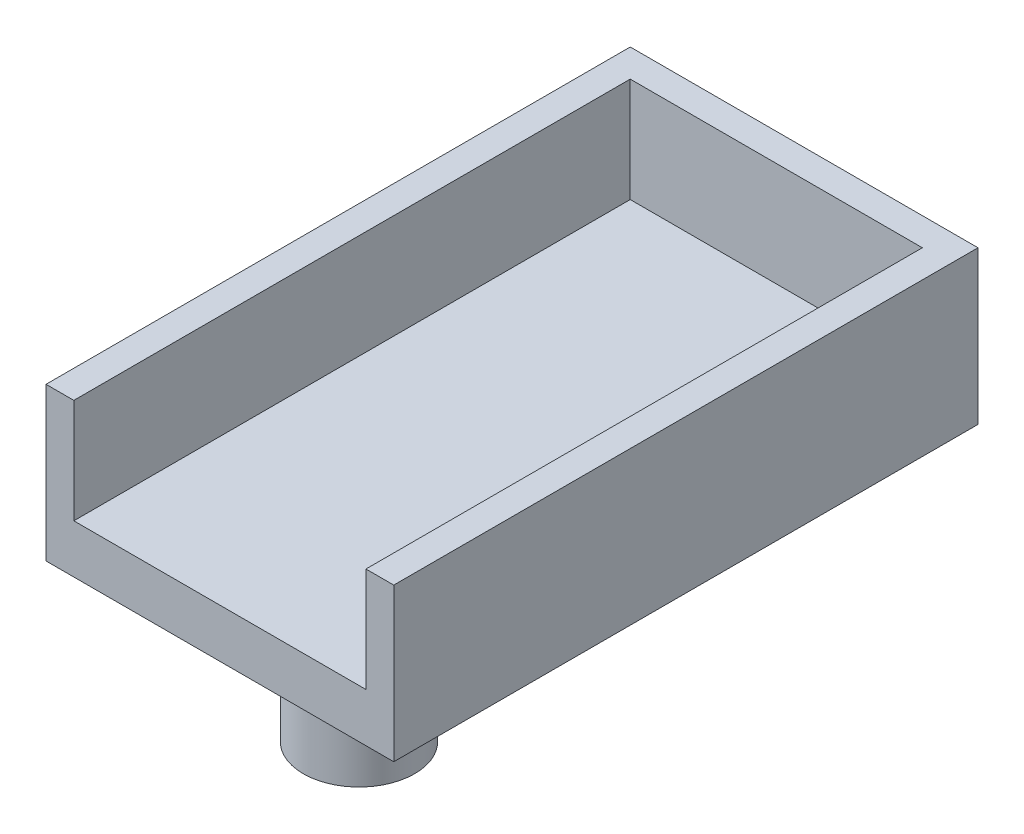
ISO-10303-21;
HEADER;
FILE_DESCRIPTION(('STEP AP214'),'2;1');
FILE_NAME('part.step','',(''),(''),'','','');
FILE_SCHEMA(('AUTOMOTIVE_DESIGN { 1 0 10303 214 1 1 1 1 }'));
ENDSEC;
DATA;
#1=APPLICATION_CONTEXT('core data for automotive mechanical design processes');
#2=APPLICATION_PROTOCOL_DEFINITION('international standard','automotive_design',2000,#1);
#3=PRODUCT_CONTEXT('',#1,'mechanical');
#4=PRODUCT('Part','Part','',(#3));
#5=PRODUCT_RELATED_PRODUCT_CATEGORY('part','',(#4));
#6=PRODUCT_DEFINITION_FORMATION('','',#4);
#7=PRODUCT_DEFINITION_CONTEXT('part definition',#1,'design');
#8=PRODUCT_DEFINITION('design','',#6,#7);
#9=PRODUCT_DEFINITION_SHAPE('','',#8);
#10=(LENGTH_UNIT() NAMED_UNIT(*) SI_UNIT(.MILLI.,.METRE.));
#11=(NAMED_UNIT(*) PLANE_ANGLE_UNIT() SI_UNIT($,.RADIAN.));
#12=(NAMED_UNIT(*) SI_UNIT($,.STERADIAN.) SOLID_ANGLE_UNIT());
#13=UNCERTAINTY_MEASURE_WITH_UNIT(LENGTH_MEASURE(1.E-05),#10,'distance_accuracy_value','');
#14=(GEOMETRIC_REPRESENTATION_CONTEXT(3) GLOBAL_UNCERTAINTY_ASSIGNED_CONTEXT((#13)) GLOBAL_UNIT_ASSIGNED_CONTEXT((#10,
#11,#12)) REPRESENTATION_CONTEXT('',''));
#15=CARTESIAN_POINT('',(0.,0.,0.));
#16=DIRECTION('',(0.,0.,1.));
#17=DIRECTION('',(1.,0.,0.));
#18=AXIS2_PLACEMENT_3D('',#15,#16,#17);
#19=CARTESIAN_POINT('',(0.,3.5,0.));
#20=DIRECTION('',(0.,1.,0.));
#21=DIRECTION('',(0.,0.,1.));
#22=AXIS2_PLACEMENT_3D('',#19,#20,#21);
#23=PLANE('',#22);
#24=DIRECTION('',(1.,0.,0.));
#25=VECTOR('',#24,1.);
#26=CARTESIAN_POINT('',(0.,3.5,0.));
#27=LINE('',#26,#25);
#28=CARTESIAN_POINT('',(2.,3.5,0.));
#29=VERTEX_POINT('',#28);
#30=CARTESIAN_POINT('',(23.,3.5,0.));
#31=VERTEX_POINT('',#30);
#32=EDGE_CURVE('E55',#29,#31,#27,.T.);
#33=ORIENTED_EDGE('',*,*,#32,.T.);
#34=DIRECTION('',(0.,0.,1.));
#35=VECTOR('',#34,1.);
#36=CARTESIAN_POINT('',(23.,3.5,-40.));
#37=LINE('',#36,#35);
#38=CARTESIAN_POINT('',(23.,3.5,-40.));
#39=VERTEX_POINT('',#38);
#40=EDGE_CURVE('E132',#39,#31,#37,.T.);
#41=ORIENTED_EDGE('',*,*,#40,.F.);
#42=DIRECTION('',(-1.,0.,0.));
#43=VECTOR('',#42,1.);
#44=CARTESIAN_POINT('',(0.,3.5,-40.));
#45=LINE('',#44,#43);
#46=CARTESIAN_POINT('',(2.,3.5,-40.));
#47=VERTEX_POINT('',#46);
#48=EDGE_CURVE('E48',#39,#47,#45,.T.);
#49=ORIENTED_EDGE('',*,*,#48,.T.);
#50=DIRECTION('',(0.,0.,-1.));
#51=VECTOR('',#50,1.);
#52=CARTESIAN_POINT('',(2.,3.5,0.));
#53=LINE('',#52,#51);
#54=EDGE_CURVE('E147',#29,#47,#53,.T.);
#55=ORIENTED_EDGE('',*,*,#54,.F.);
#56=EDGE_LOOP('',(#33,#41,#49,#55));
#57=FACE_BOUND('',#56,.T.);
#58=ADVANCED_FACE('F33',(#57),#23,.T.);
#59=CARTESIAN_POINT('',(0.,3.5,-40.));
#60=DIRECTION('',(1.,0.,0.));
#61=DIRECTION('',(0.,0.,-1.));
#62=AXIS2_PLACEMENT_3D('',#59,#60,#61);
#63=PLANE('',#62);
#64=DIRECTION('',(0.,0.,1.));
#65=VECTOR('',#64,1.);
#66=CARTESIAN_POINT('',(0.,0.,-40.));
#67=LINE('',#66,#65);
#68=CARTESIAN_POINT('',(0.,0.,-42.));
#69=VERTEX_POINT('',#68);
#70=CARTESIAN_POINT('',(0.,0.,0.));
#71=VERTEX_POINT('',#70);
#72=EDGE_CURVE('E114',#69,#71,#67,.T.);
#73=ORIENTED_EDGE('',*,*,#72,.T.);
#74=DIRECTION('',(0.,-1.,0.));
#75=VECTOR('',#74,1.);
#76=CARTESIAN_POINT('',(0.,3.5,0.));
#77=LINE('',#76,#75);
#78=CARTESIAN_POINT('',(0.,11.,0.));
#79=VERTEX_POINT('',#78);
#80=EDGE_CURVE('E41',#79,#71,#77,.T.);
#81=ORIENTED_EDGE('',*,*,#80,.F.);
#82=DIRECTION('',(0.,0.,1.));
#83=VECTOR('',#82,1.);
#84=CARTESIAN_POINT('',(0.,11.,0.));
#85=LINE('',#84,#83);
#86=CARTESIAN_POINT('',(0.,11.,-42.));
#87=VERTEX_POINT('',#86);
#88=EDGE_CURVE('E148',#87,#79,#85,.T.);
#89=ORIENTED_EDGE('',*,*,#88,.F.);
#90=DIRECTION('',(0.,-1.,0.));
#91=VECTOR('',#90,1.);
#92=CARTESIAN_POINT('',(0.,11.,-42.));
#93=LINE('',#92,#91);
#94=EDGE_CURVE('E118',#87,#69,#93,.T.);
#95=ORIENTED_EDGE('',*,*,#94,.T.);
#96=EDGE_LOOP('',(#73,#81,#89,#95));
#97=FACE_BOUND('',#96,.T.);
#98=ADVANCED_FACE('F35',(#97),#63,.F.);
#99=CARTESIAN_POINT('',(0.,3.5,0.));
#100=DIRECTION('',(0.,0.,-1.));
#101=DIRECTION('',(-1.,0.,0.));
#102=AXIS2_PLACEMENT_3D('',#99,#100,#101);
#103=PLANE('',#102);
#104=DIRECTION('',(1.,0.,0.));
#105=VECTOR('',#104,1.);
#106=CARTESIAN_POINT('',(0.,0.,0.));
#107=LINE('',#106,#105);
#108=CARTESIAN_POINT('',(25.,0.,0.));
#109=VERTEX_POINT('',#108);
#110=EDGE_CURVE('E108',#71,#109,#107,.T.);
#111=ORIENTED_EDGE('',*,*,#110,.T.);
#112=DIRECTION('',(0.,-1.,0.));
#113=VECTOR('',#112,1.);
#114=CARTESIAN_POINT('',(25.,3.5,0.));
#115=LINE('',#114,#113);
#116=CARTESIAN_POINT('',(25.,11.,0.));
#117=VERTEX_POINT('',#116);
#118=EDGE_CURVE('E106',#117,#109,#115,.T.);
#119=ORIENTED_EDGE('',*,*,#118,.F.);
#120=DIRECTION('',(1.,0.,0.));
#121=VECTOR('',#120,1.);
#122=CARTESIAN_POINT('',(25.,11.,0.));
#123=LINE('',#122,#121);
#124=CARTESIAN_POINT('',(23.,11.,0.));
#125=VERTEX_POINT('',#124);
#126=EDGE_CURVE('E137',#125,#117,#123,.T.);
#127=ORIENTED_EDGE('',*,*,#126,.F.);
#128=DIRECTION('',(0.,-1.,0.));
#129=VECTOR('',#128,1.);
#130=CARTESIAN_POINT('',(23.,11.,0.));
#131=LINE('',#130,#129);
#132=EDGE_CURVE('E140',#125,#31,#131,.T.);
#133=ORIENTED_EDGE('',*,*,#132,.T.);
#134=ORIENTED_EDGE('',*,*,#32,.F.);
#135=DIRECTION('',(0.,-1.,0.));
#136=VECTOR('',#135,1.);
#137=CARTESIAN_POINT('',(2.,11.,0.));
#138=LINE('',#137,#136);
#139=CARTESIAN_POINT('',(2.,11.,0.));
#140=VERTEX_POINT('',#139);
#141=EDGE_CURVE('E160',#140,#29,#138,.T.);
#142=ORIENTED_EDGE('',*,*,#141,.F.);
#143=DIRECTION('',(1.,0.,0.));
#144=VECTOR('',#143,1.);
#145=CARTESIAN_POINT('',(0.,11.,0.));
#146=LINE('',#145,#144);
#147=EDGE_CURVE('E151',#79,#140,#146,.T.);
#148=ORIENTED_EDGE('',*,*,#147,.F.);
#149=ORIENTED_EDGE('',*,*,#80,.T.);
#150=EDGE_LOOP('',(#111,#119,#127,#133,#134,#142,#148,#149));
#151=FACE_BOUND('',#150,.T.);
#152=ADVANCED_FACE('F170',(#151),#103,.F.);
#153=CARTESIAN_POINT('',(25.,3.5,-40.));
#154=DIRECTION('',(-1.,0.,0.));
#155=DIRECTION('',(0.,0.,1.));
#156=AXIS2_PLACEMENT_3D('',#153,#154,#155);
#157=PLANE('',#156);
#158=DIRECTION('',(0.,0.,-1.));
#159=VECTOR('',#158,1.);
#160=CARTESIAN_POINT('',(25.,0.,-40.));
#161=LINE('',#160,#159);
#162=CARTESIAN_POINT('',(25.,0.,-42.));
#163=VERTEX_POINT('',#162);
#164=EDGE_CURVE('E99',#109,#163,#161,.T.);
#165=ORIENTED_EDGE('',*,*,#164,.T.);
#166=DIRECTION('',(0.,-1.,0.));
#167=VECTOR('',#166,1.);
#168=CARTESIAN_POINT('',(25.,11.,-42.));
#169=LINE('',#168,#167);
#170=CARTESIAN_POINT('',(25.,11.,-42.));
#171=VERTEX_POINT('',#170);
#172=EDGE_CURVE('E104',#171,#163,#169,.T.);
#173=ORIENTED_EDGE('',*,*,#172,.F.);
#174=DIRECTION('',(0.,0.,-1.));
#175=VECTOR('',#174,1.);
#176=CARTESIAN_POINT('',(25.,11.,-40.));
#177=LINE('',#176,#175);
#178=EDGE_CURVE('E133',#117,#171,#177,.T.);
#179=ORIENTED_EDGE('',*,*,#178,.F.);
#180=ORIENTED_EDGE('',*,*,#118,.T.);
#181=EDGE_LOOP('',(#165,#173,#179,#180));
#182=FACE_BOUND('',#181,.T.);
#183=ADVANCED_FACE('F101',(#182),#157,.F.);
#184=CARTESIAN_POINT('',(0.,0.,0.));
#185=DIRECTION('',(0.,1.,0.));
#186=DIRECTION('',(0.,0.,1.));
#187=AXIS2_PLACEMENT_3D('',#184,#185,#186);
#188=PLANE('',#187);
#189=CARTESIAN_POINT('',(12.5,0.,-10.));
#190=DIRECTION('',(0.,1.,0.));
#191=DIRECTION('',(0.,0.,1.));
#192=AXIS2_PLACEMENT_3D('',#189,#190,#191);
#193=CIRCLE('',#192,4.);
#194=CARTESIAN_POINT('',(12.5,0.,-6.));
#195=VERTEX_POINT('',#194);
#196=EDGE_CURVE('E11',#195,#195,#193,.F.);
#197=ORIENTED_EDGE('',*,*,#196,.F.);
#198=EDGE_LOOP('',(#197));
#199=FACE_BOUND('',#198,.T.);
#200=ORIENTED_EDGE('',*,*,#72,.F.);
#201=DIRECTION('',(-1.,0.,0.));
#202=VECTOR('',#201,1.);
#203=CARTESIAN_POINT('',(25.,0.,-42.));
#204=LINE('',#203,#202);
#205=EDGE_CURVE('E111',#163,#69,#204,.T.);
#206=ORIENTED_EDGE('',*,*,#205,.F.);
#207=ORIENTED_EDGE('',*,*,#164,.F.);
#208=ORIENTED_EDGE('',*,*,#110,.F.);
#209=EDGE_LOOP('',(#200,#206,#207,#208));
#210=FACE_BOUND('',#209,.T.);
#211=ADVANCED_FACE('F112',(#199,#210),#188,.F.);
#212=CARTESIAN_POINT('',(2.,11.,0.));
#213=DIRECTION('',(-1.,0.,0.));
#214=DIRECTION('',(0.,0.,1.));
#215=AXIS2_PLACEMENT_3D('',#212,#213,#214);
#216=PLANE('',#215);
#217=ORIENTED_EDGE('',*,*,#54,.T.);
#218=DIRECTION('',(0.,-1.,0.));
#219=VECTOR('',#218,1.);
#220=CARTESIAN_POINT('',(2.,11.,-40.));
#221=LINE('',#220,#219);
#222=CARTESIAN_POINT('',(2.,11.,-40.));
#223=VERTEX_POINT('',#222);
#224=EDGE_CURVE('E156',#223,#47,#221,.T.);
#225=ORIENTED_EDGE('',*,*,#224,.F.);
#226=DIRECTION('',(0.,0.,-1.));
#227=VECTOR('',#226,1.);
#228=CARTESIAN_POINT('',(2.,11.,0.));
#229=LINE('',#228,#227);
#230=EDGE_CURVE('E153',#140,#223,#229,.T.);
#231=ORIENTED_EDGE('',*,*,#230,.F.);
#232=ORIENTED_EDGE('',*,*,#141,.T.);
#233=EDGE_LOOP('',(#217,#225,#231,#232));
#234=FACE_BOUND('',#233,.T.);
#235=ADVANCED_FACE('F183',(#234),#216,.F.);
#236=CARTESIAN_POINT('',(0.,11.,0.));
#237=DIRECTION('',(0.,-1.,0.));
#238=DIRECTION('',(0.,0.,-1.));
#239=AXIS2_PLACEMENT_3D('',#236,#237,#238);
#240=PLANE('',#239);
#241=ORIENTED_EDGE('',*,*,#88,.T.);
#242=ORIENTED_EDGE('',*,*,#147,.T.);
#243=ORIENTED_EDGE('',*,*,#230,.T.);
#244=DIRECTION('',(-1.,0.,0.));
#245=VECTOR('',#244,1.);
#246=CARTESIAN_POINT('',(25.,11.,-40.));
#247=LINE('',#246,#245);
#248=CARTESIAN_POINT('',(23.,11.,-40.));
#249=VERTEX_POINT('',#248);
#250=EDGE_CURVE('E123',#249,#223,#247,.T.);
#251=ORIENTED_EDGE('',*,*,#250,.F.);
#252=DIRECTION('',(0.,0.,1.));
#253=VECTOR('',#252,1.);
#254=CARTESIAN_POINT('',(23.,11.,-40.));
#255=LINE('',#254,#253);
#256=EDGE_CURVE('E135',#249,#125,#255,.T.);
#257=ORIENTED_EDGE('',*,*,#256,.T.);
#258=ORIENTED_EDGE('',*,*,#126,.T.);
#259=ORIENTED_EDGE('',*,*,#178,.T.);
#260=DIRECTION('',(-1.,0.,0.));
#261=VECTOR('',#260,1.);
#262=CARTESIAN_POINT('',(25.,11.,-42.));
#263=LINE('',#262,#261);
#264=EDGE_CURVE('E122',#171,#87,#263,.T.);
#265=ORIENTED_EDGE('',*,*,#264,.T.);
#266=EDGE_LOOP('',(#241,#242,#243,#251,#257,#258,#259,#265));
#267=FACE_BOUND('',#266,.T.);
#268=ADVANCED_FACE('F174',(#267),#240,.F.);
#269=CARTESIAN_POINT('',(23.,11.,-40.));
#270=DIRECTION('',(1.,0.,0.));
#271=DIRECTION('',(0.,0.,-1.));
#272=AXIS2_PLACEMENT_3D('',#269,#270,#271);
#273=PLANE('',#272);
#274=ORIENTED_EDGE('',*,*,#40,.T.);
#275=ORIENTED_EDGE('',*,*,#132,.F.);
#276=ORIENTED_EDGE('',*,*,#256,.F.);
#277=DIRECTION('',(0.,-1.,0.));
#278=VECTOR('',#277,1.);
#279=CARTESIAN_POINT('',(23.,11.,-40.));
#280=LINE('',#279,#278);
#281=EDGE_CURVE('E144',#249,#39,#280,.T.);
#282=ORIENTED_EDGE('',*,*,#281,.T.);
#283=EDGE_LOOP('',(#274,#275,#276,#282));
#284=FACE_BOUND('',#283,.T.);
#285=ADVANCED_FACE('F180',(#284),#273,.F.);
#286=CARTESIAN_POINT('',(12.5,-10.,-10.));
#287=DIRECTION('',(0.,1.,0.));
#288=DIRECTION('',(0.,0.,1.));
#289=AXIS2_PLACEMENT_3D('',#286,#287,#288);
#290=CYLINDRICAL_SURFACE('',#289,4.);
#291=CARTESIAN_POINT('',(12.5,-10.,-10.));
#292=DIRECTION('',(0.,-1.,0.));
#293=DIRECTION('',(0.,0.,-1.));
#294=AXIS2_PLACEMENT_3D('',#291,#292,#293);
#295=CIRCLE('',#294,4.);
#296=CARTESIAN_POINT('',(12.5,-10.,-14.));
#297=VERTEX_POINT('',#296);
#298=EDGE_CURVE('E128',#297,#297,#295,.T.);
#299=ORIENTED_EDGE('',*,*,#298,.F.);
#300=EDGE_LOOP('',(#299));
#301=FACE_BOUND('',#300,.T.);
#302=ORIENTED_EDGE('',*,*,#196,.T.);
#303=EDGE_LOOP('',(#302));
#304=FACE_BOUND('',#303,.T.);
#305=ADVANCED_FACE('F194',(#301,#304),#290,.T.);
#306=CARTESIAN_POINT('',(12.5,-10.,-10.));
#307=DIRECTION('',(0.,-1.,0.));
#308=DIRECTION('',(0.,0.,-1.));
#309=AXIS2_PLACEMENT_3D('',#306,#307,#308);
#310=PLANE('',#309);
#311=ORIENTED_EDGE('',*,*,#298,.T.);
#312=EDGE_LOOP('',(#311));
#313=FACE_BOUND('',#312,.T.);
#314=ADVANCED_FACE('F187',(#313),#310,.T.);
#315=CARTESIAN_POINT('',(0.,0.,-40.));
#316=DIRECTION('',(0.,0.,-1.));
#317=DIRECTION('',(-1.,0.,0.));
#318=AXIS2_PLACEMENT_3D('',#315,#316,#317);
#319=PLANE('',#318);
#320=ORIENTED_EDGE('',*,*,#250,.T.);
#321=ORIENTED_EDGE('',*,*,#224,.T.);
#322=ORIENTED_EDGE('',*,*,#48,.F.);
#323=ORIENTED_EDGE('',*,*,#281,.F.);
#324=EDGE_LOOP('',(#320,#321,#322,#323));
#325=FACE_BOUND('',#324,.T.);
#326=ADVANCED_FACE('F185',(#325),#319,.F.);
#327=CARTESIAN_POINT('',(0.,0.,-42.));
#328=DIRECTION('',(0.,0.,-1.));
#329=DIRECTION('',(-1.,0.,0.));
#330=AXIS2_PLACEMENT_3D('',#327,#328,#329);
#331=PLANE('',#330);
#332=ORIENTED_EDGE('',*,*,#172,.T.);
#333=ORIENTED_EDGE('',*,*,#205,.T.);
#334=ORIENTED_EDGE('',*,*,#94,.F.);
#335=ORIENTED_EDGE('',*,*,#264,.F.);
#336=EDGE_LOOP('',(#332,#333,#334,#335));
#337=FACE_BOUND('',#336,.T.);
#338=ADVANCED_FACE('F120',(#337),#331,.T.);
#339=CLOSED_SHELL('',(#58,#98,#152,#183,#211,#235,#268,#285,#305,#314,#326,#338));
#340=MANIFOLD_SOLID_BREP('B2',#339);
#341=ADVANCED_BREP_SHAPE_REPRESENTATION('',(#18,#340),#14);
#342=SHAPE_DEFINITION_REPRESENTATION(#9,#341);
ENDSEC;
END-ISO-10303-21;
